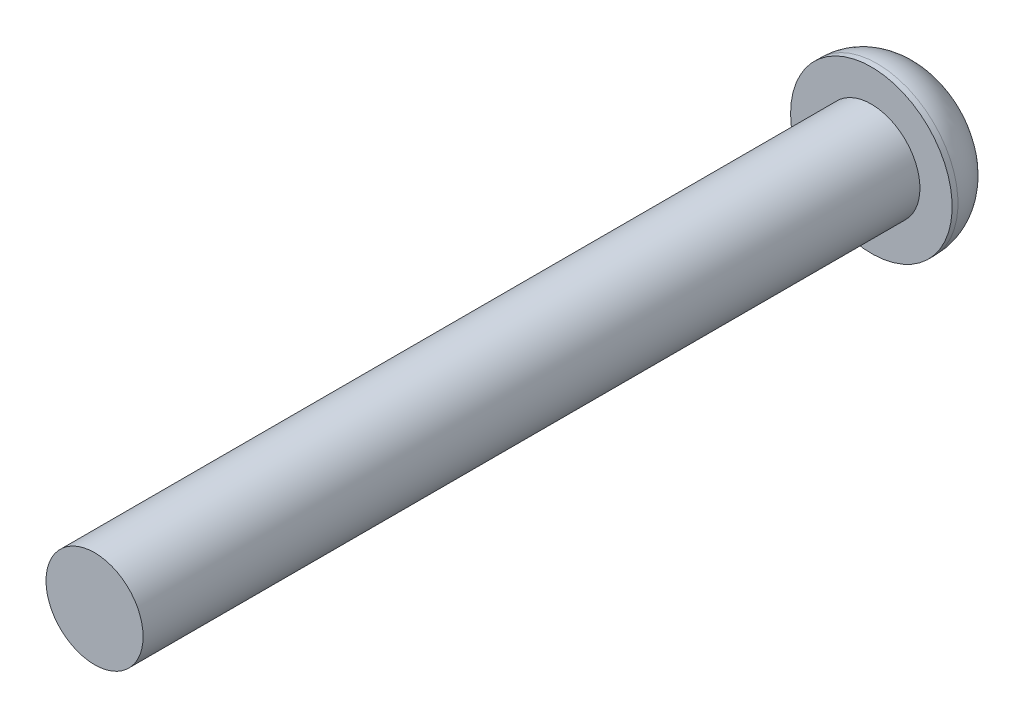
ISO-10303-21;
HEADER;
FILE_DESCRIPTION(('STEP AP214'),'2;1');
FILE_NAME('part.step','',(''),(''),'','','');
FILE_SCHEMA(('AUTOMOTIVE_DESIGN { 1 0 10303 214 1 1 1 1 }'));
ENDSEC;
DATA;
#1=APPLICATION_CONTEXT('core data for automotive mechanical design processes');
#2=APPLICATION_PROTOCOL_DEFINITION('international standard','automotive_design',2000,#1);
#3=PRODUCT_CONTEXT('',#1,'mechanical');
#4=PRODUCT('Part','Part','',(#3));
#5=PRODUCT_RELATED_PRODUCT_CATEGORY('part','',(#4));
#6=PRODUCT_DEFINITION_FORMATION('','',#4);
#7=PRODUCT_DEFINITION_CONTEXT('part definition',#1,'design');
#8=PRODUCT_DEFINITION('design','',#6,#7);
#9=PRODUCT_DEFINITION_SHAPE('','',#8);
#10=(LENGTH_UNIT() NAMED_UNIT(*) SI_UNIT(.MILLI.,.METRE.));
#11=(NAMED_UNIT(*) PLANE_ANGLE_UNIT() SI_UNIT($,.RADIAN.));
#12=(NAMED_UNIT(*) SI_UNIT($,.STERADIAN.) SOLID_ANGLE_UNIT());
#13=UNCERTAINTY_MEASURE_WITH_UNIT(LENGTH_MEASURE(1.E-05),#10,'distance_accuracy_value','');
#14=(GEOMETRIC_REPRESENTATION_CONTEXT(3) GLOBAL_UNCERTAINTY_ASSIGNED_CONTEXT((#13)) GLOBAL_UNIT_ASSIGNED_CONTEXT((#10,
#11,#12)) REPRESENTATION_CONTEXT('',''));
#15=CARTESIAN_POINT('',(0.,0.,0.));
#16=DIRECTION('',(0.,0.,1.));
#17=DIRECTION('',(1.,0.,0.));
#18=AXIS2_PLACEMENT_3D('',#15,#16,#17);
#19=CARTESIAN_POINT('',(0.,0.,40.));
#20=DIRECTION('',(0.,0.,-1.));
#21=DIRECTION('',(-1.,0.,0.));
#22=AXIS2_PLACEMENT_3D('',#19,#20,#21);
#23=CYLINDRICAL_SURFACE('',#22,2.5);
#24=CARTESIAN_POINT('',(0.,0.,40.));
#25=DIRECTION('',(0.,0.,1.));
#26=DIRECTION('',(1.,0.,0.));
#27=AXIS2_PLACEMENT_3D('',#24,#25,#26);
#28=CIRCLE('',#27,2.5);
#29=CARTESIAN_POINT('',(2.5,0.,40.));
#30=VERTEX_POINT('',#29);
#31=EDGE_CURVE('E146',#30,#30,#28,.T.);
#32=ORIENTED_EDGE('',*,*,#31,.F.);
#33=EDGE_LOOP('',(#32));
#34=FACE_BOUND('',#33,.T.);
#35=CARTESIAN_POINT('',(0.,0.,0.));
#36=DIRECTION('',(0.,0.,-1.));
#37=DIRECTION('',(-1.,0.,0.));
#38=AXIS2_PLACEMENT_3D('',#35,#36,#37);
#39=CIRCLE('',#38,2.5);
#40=CARTESIAN_POINT('',(-2.5,0.,0.));
#41=VERTEX_POINT('',#40);
#42=EDGE_CURVE('E143',#41,#41,#39,.T.);
#43=ORIENTED_EDGE('',*,*,#42,.F.);
#44=EDGE_LOOP('',(#43));
#45=FACE_BOUND('',#44,.T.);
#46=ADVANCED_FACE('F33',(#34,#45),#23,.T.);
#47=CARTESIAN_POINT('',(0.,0.,40.));
#48=DIRECTION('',(0.,0.,1.));
#49=DIRECTION('',(1.,0.,0.));
#50=AXIS2_PLACEMENT_3D('',#47,#48,#49);
#51=PLANE('',#50);
#52=ORIENTED_EDGE('',*,*,#31,.T.);
#53=EDGE_LOOP('',(#52));
#54=FACE_BOUND('',#53,.T.);
#55=ADVANCED_FACE('F167',(#54),#51,.T.);
#56=CARTESIAN_POINT('',(0.,0.,0.));
#57=DIRECTION('',(0.,0.,-1.));
#58=DIRECTION('',(-1.,0.,0.));
#59=AXIS2_PLACEMENT_3D('',#56,#57,#58);
#60=PLANE('',#59);
#61=CARTESIAN_POINT('',(0.,0.,0.));
#62=DIRECTION('',(0.,0.,-1.));
#63=DIRECTION('',(-1.,0.,0.));
#64=AXIS2_PLACEMENT_3D('',#61,#62,#63);
#65=CIRCLE('',#64,4.15958487677486);
#66=CARTESIAN_POINT('',(-4.15958487677486,0.,0.));
#67=VERTEX_POINT('',#66);
#68=EDGE_CURVE('E135',#67,#67,#65,.T.);
#69=ORIENTED_EDGE('',*,*,#68,.F.);
#70=EDGE_LOOP('',(#69));
#71=FACE_BOUND('',#70,.T.);
#72=ORIENTED_EDGE('',*,*,#42,.T.);
#73=EDGE_LOOP('',(#72));
#74=FACE_BOUND('',#73,.T.);
#75=ADVANCED_FACE('F172',(#71,#74),#60,.F.);
#76=CARTESIAN_POINT('',(0.,0.,-2.8));
#77=DIRECTION('',(0.,0.,1.));
#78=DIRECTION('',(1.,0.,0.));
#79=AXIS2_PLACEMENT_3D('',#76,#77,#78);
#80=CYLINDRICAL_SURFACE('',#79,4.15958487677486);
#81=CARTESIAN_POINT('',(0.,0.,-0.3));
#82=DIRECTION('',(0.,0.,-1.));
#83=DIRECTION('',(-1.,0.,0.));
#84=AXIS2_PLACEMENT_3D('',#81,#82,#83);
#85=CIRCLE('',#84,4.15958487677486);
#86=CARTESIAN_POINT('',(-4.15958487677486,0.,-0.3));
#87=VERTEX_POINT('',#86);
#88=EDGE_CURVE('E11',#87,#87,#85,.F.);
#89=ORIENTED_EDGE('',*,*,#88,.T.);
#90=EDGE_LOOP('',(#89));
#91=FACE_BOUND('',#90,.T.);
#92=ORIENTED_EDGE('',*,*,#68,.T.);
#93=EDGE_LOOP('',(#92));
#94=FACE_BOUND('',#93,.T.);
#95=ADVANCED_FACE('F162',(#91,#94),#80,.T.);
#96=CARTESIAN_POINT('',(0.,0.,-2.8));
#97=DIRECTION('',(0.,0.,-1.));
#98=DIRECTION('',(-1.,0.,0.));
#99=AXIS2_PLACEMENT_3D('',#96,#97,#98);
#100=PLANE('',#99);
#101=DIRECTION('',(-0.814788791019046,0.579757902947188,0.));
#102=VECTOR('',#101,1.);
#103=CARTESIAN_POINT('',(-0.144973678126217,-1.52414450415627,-2.8));
#104=LINE('',#103,#102);
#105=CARTESIAN_POINT('',(-0.144973678126217,-1.52414450415627,-2.8));
#106=VERTEX_POINT('',#105);
#107=CARTESIAN_POINT('',(-1.39243469870088,-0.636521363940765,-2.8));
#108=VERTEX_POINT('',#107);
#109=EDGE_CURVE('E48',#106,#108,#104,.T.);
#110=ORIENTED_EDGE('',*,*,#109,.F.);
#111=DIRECTION('',(-0.909479467506581,-0.415748840267711,0.));
#112=VECTOR('',#111,1.);
#113=CARTESIAN_POINT('',(1.24746102057466,-0.887623140215509,-2.8));
#114=LINE('',#113,#112);
#115=CARTESIAN_POINT('',(1.24746102057466,-0.887623140215509,-2.8));
#116=VERTEX_POINT('',#115);
#117=EDGE_CURVE('E131',#116,#106,#114,.T.);
#118=ORIENTED_EDGE('',*,*,#117,.F.);
#119=DIRECTION('',(-0.0946906764875342,-0.995506743214898,0.));
#120=VECTOR('',#119,1.);
#121=CARTESIAN_POINT('',(1.39243469870088,0.636521363940765,-2.8));
#122=LINE('',#121,#120);
#123=CARTESIAN_POINT('',(1.39243469870088,0.636521363940765,-2.8));
#124=VERTEX_POINT('',#123);
#125=EDGE_CURVE('E129',#124,#116,#122,.T.);
#126=ORIENTED_EDGE('',*,*,#125,.F.);
#127=DIRECTION('',(0.814788791019046,-0.579757902947188,0.));
#128=VECTOR('',#127,1.);
#129=CARTESIAN_POINT('',(0.144973678126217,1.52414450415627,-2.8));
#130=LINE('',#129,#128);
#131=CARTESIAN_POINT('',(0.144973678126217,1.52414450415627,-2.8));
#132=VERTEX_POINT('',#131);
#133=EDGE_CURVE('E96',#132,#124,#130,.T.);
#134=ORIENTED_EDGE('',*,*,#133,.F.);
#135=DIRECTION('',(0.909479467506581,0.41574884026771,0.));
#136=VECTOR('',#135,1.);
#137=CARTESIAN_POINT('',(-1.24746102057466,0.88762314021551,-2.8));
#138=LINE('',#137,#136);
#139=CARTESIAN_POINT('',(-1.24746102057466,0.88762314021551,-2.8));
#140=VERTEX_POINT('',#139);
#141=EDGE_CURVE('E125',#140,#132,#138,.T.);
#142=ORIENTED_EDGE('',*,*,#141,.F.);
#143=DIRECTION('',(0.0946906764875343,0.995506743214898,0.));
#144=VECTOR('',#143,1.);
#145=CARTESIAN_POINT('',(-1.39243469870088,-0.636521363940765,-2.8));
#146=LINE('',#145,#144);
#147=EDGE_CURVE('E122',#108,#140,#146,.T.);
#148=ORIENTED_EDGE('',*,*,#147,.F.);
#149=EDGE_LOOP('',(#110,#118,#126,#134,#142,#148));
#150=FACE_BOUND('',#149,.T.);
#151=CARTESIAN_POINT('',(0.,0.,-2.8));
#152=DIRECTION('',(0.,0.,-1.));
#153=DIRECTION('',(-1.,0.,0.));
#154=AXIS2_PLACEMENT_3D('',#151,#152,#153);
#155=CIRCLE('',#154,1.65958487677486);
#156=CARTESIAN_POINT('',(-1.65958487677486,0.,-2.8));
#157=VERTEX_POINT('',#156);
#158=EDGE_CURVE('E41',#157,#157,#155,.T.);
#159=ORIENTED_EDGE('',*,*,#158,.T.);
#160=EDGE_LOOP('',(#159));
#161=FACE_BOUND('',#160,.T.);
#162=ADVANCED_FACE('F151',(#150,#161),#100,.T.);
#163=CARTESIAN_POINT('',(0.,0.,-0.3));
#164=DIRECTION('',(0.,0.,-1.));
#165=DIRECTION('',(-1.,0.,0.));
#166=AXIS2_PLACEMENT_3D('',#163,#164,#165);
#167=DEGENERATE_TOROIDAL_SURFACE('',#166,1.65958487677486,2.5,.T.);
#168=ORIENTED_EDGE('',*,*,#88,.F.);
#169=EDGE_LOOP('',(#168));
#170=FACE_BOUND('',#169,.T.);
#171=ORIENTED_EDGE('',*,*,#158,.F.);
#172=EDGE_LOOP('',(#171));
#173=FACE_BOUND('',#172,.T.);
#174=ADVANCED_FACE('F35',(#170,#173),#167,.T.);
#175=CARTESIAN_POINT('',(-0.144973678126217,-1.52414450415627,-0.8));
#176=DIRECTION('',(-0.579757902947188,-0.814788791019046,0.));
#177=DIRECTION('',(0.814788791019046,-0.579757902947188,0.));
#178=AXIS2_PLACEMENT_3D('',#175,#176,#177);
#179=PLANE('',#178);
#180=ORIENTED_EDGE('',*,*,#109,.T.);
#181=DIRECTION('',(0.,0.,-1.));
#182=VECTOR('',#181,1.);
#183=CARTESIAN_POINT('',(-1.39243469870088,-0.636521363940765,-0.8));
#184=LINE('',#183,#182);
#185=CARTESIAN_POINT('',(-1.39243469870088,-0.636521363940765,-0.8));
#186=VERTEX_POINT('',#185);
#187=EDGE_CURVE('E78',#186,#108,#184,.T.);
#188=ORIENTED_EDGE('',*,*,#187,.F.);
#189=DIRECTION('',(-0.814788791019046,0.579757902947188,0.));
#190=VECTOR('',#189,1.);
#191=CARTESIAN_POINT('',(-0.144973678126217,-1.52414450415627,-0.8));
#192=LINE('',#191,#190);
#193=CARTESIAN_POINT('',(-0.144973678126217,-1.52414450415627,-0.8));
#194=VERTEX_POINT('',#193);
#195=EDGE_CURVE('E133',#194,#186,#192,.T.);
#196=ORIENTED_EDGE('',*,*,#195,.F.);
#197=DIRECTION('',(0.,0.,-1.));
#198=VECTOR('',#197,1.);
#199=CARTESIAN_POINT('',(-0.144973678126217,-1.52414450415627,-0.8));
#200=LINE('',#199,#198);
#201=EDGE_CURVE('E56',#194,#106,#200,.T.);
#202=ORIENTED_EDGE('',*,*,#201,.T.);
#203=EDGE_LOOP('',(#180,#188,#196,#202));
#204=FACE_BOUND('',#203,.T.);
#205=ADVANCED_FACE('F154',(#204),#179,.F.);
#206=CARTESIAN_POINT('',(1.24746102057466,-0.887623140215509,-0.8));
#207=DIRECTION('',(0.415748840267711,-0.909479467506581,0.));
#208=DIRECTION('',(0.909479467506581,0.415748840267711,0.));
#209=AXIS2_PLACEMENT_3D('',#206,#207,#208);
#210=PLANE('',#209);
#211=ORIENTED_EDGE('',*,*,#117,.T.);
#212=ORIENTED_EDGE('',*,*,#201,.F.);
#213=DIRECTION('',(-0.909479467506581,-0.415748840267711,0.));
#214=VECTOR('',#213,1.);
#215=CARTESIAN_POINT('',(1.24746102057466,-0.887623140215509,-0.8));
#216=LINE('',#215,#214);
#217=CARTESIAN_POINT('',(1.24746102057466,-0.887623140215509,-0.8));
#218=VERTEX_POINT('',#217);
#219=EDGE_CURVE('E108',#218,#194,#216,.T.);
#220=ORIENTED_EDGE('',*,*,#219,.F.);
#221=DIRECTION('',(0.,0.,-1.));
#222=VECTOR('',#221,1.);
#223=CARTESIAN_POINT('',(1.24746102057466,-0.887623140215509,-0.8));
#224=LINE('',#223,#222);
#225=EDGE_CURVE('E100',#218,#116,#224,.T.);
#226=ORIENTED_EDGE('',*,*,#225,.T.);
#227=EDGE_LOOP('',(#211,#212,#220,#226));
#228=FACE_BOUND('',#227,.T.);
#229=ADVANCED_FACE('F160',(#228),#210,.F.);
#230=CARTESIAN_POINT('',(1.39243469870088,0.636521363940765,-0.8));
#231=DIRECTION('',(0.995506743214898,-0.0946906764875343,0.));
#232=DIRECTION('',(0.0946906764875343,0.995506743214898,0.));
#233=AXIS2_PLACEMENT_3D('',#230,#231,#232);
#234=PLANE('',#233);
#235=ORIENTED_EDGE('',*,*,#125,.T.);
#236=ORIENTED_EDGE('',*,*,#225,.F.);
#237=DIRECTION('',(-0.0946906764875342,-0.995506743214898,0.));
#238=VECTOR('',#237,1.);
#239=CARTESIAN_POINT('',(1.39243469870088,0.636521363940765,-0.8));
#240=LINE('',#239,#238);
#241=CARTESIAN_POINT('',(1.39243469870088,0.636521363940765,-0.8));
#242=VERTEX_POINT('',#241);
#243=EDGE_CURVE('E104',#242,#218,#240,.T.);
#244=ORIENTED_EDGE('',*,*,#243,.F.);
#245=DIRECTION('',(0.,0.,-1.));
#246=VECTOR('',#245,1.);
#247=CARTESIAN_POINT('',(1.39243469870088,0.636521363940765,-0.8));
#248=LINE('',#247,#246);
#249=EDGE_CURVE('E89',#242,#124,#248,.T.);
#250=ORIENTED_EDGE('',*,*,#249,.T.);
#251=EDGE_LOOP('',(#235,#236,#244,#250));
#252=FACE_BOUND('',#251,.T.);
#253=ADVANCED_FACE('F105',(#252),#234,.F.);
#254=CARTESIAN_POINT('',(0.144973678126217,1.52414450415627,-0.8));
#255=DIRECTION('',(0.579757902947188,0.814788791019046,0.));
#256=DIRECTION('',(-0.814788791019047,0.579757902947188,0.));
#257=AXIS2_PLACEMENT_3D('',#254,#255,#256);
#258=PLANE('',#257);
#259=ORIENTED_EDGE('',*,*,#133,.T.);
#260=ORIENTED_EDGE('',*,*,#249,.F.);
#261=DIRECTION('',(0.814788791019046,-0.579757902947188,0.));
#262=VECTOR('',#261,1.);
#263=CARTESIAN_POINT('',(0.144973678126217,1.52414450415627,-0.8));
#264=LINE('',#263,#262);
#265=CARTESIAN_POINT('',(0.144973678126217,1.52414450415627,-0.8));
#266=VERTEX_POINT('',#265);
#267=EDGE_CURVE('E93',#266,#242,#264,.T.);
#268=ORIENTED_EDGE('',*,*,#267,.F.);
#269=DIRECTION('',(0.,0.,-1.));
#270=VECTOR('',#269,1.);
#271=CARTESIAN_POINT('',(0.144973678126217,1.52414450415627,-0.8));
#272=LINE('',#271,#270);
#273=EDGE_CURVE('E101',#266,#132,#272,.T.);
#274=ORIENTED_EDGE('',*,*,#273,.T.);
#275=EDGE_LOOP('',(#259,#260,#268,#274));
#276=FACE_BOUND('',#275,.T.);
#277=ADVANCED_FACE('F91',(#276),#258,.F.);
#278=CARTESIAN_POINT('',(-1.24746102057466,0.88762314021551,-0.8));
#279=DIRECTION('',(-0.41574884026771,0.909479467506581,0.));
#280=DIRECTION('',(-0.909479467506581,-0.41574884026771,0.));
#281=AXIS2_PLACEMENT_3D('',#278,#279,#280);
#282=PLANE('',#281);
#283=ORIENTED_EDGE('',*,*,#141,.T.);
#284=ORIENTED_EDGE('',*,*,#273,.F.);
#285=DIRECTION('',(0.909479467506581,0.41574884026771,0.));
#286=VECTOR('',#285,1.);
#287=CARTESIAN_POINT('',(-1.24746102057466,0.88762314021551,-0.8));
#288=LINE('',#287,#286);
#289=CARTESIAN_POINT('',(-1.24746102057466,0.88762314021551,-0.8));
#290=VERTEX_POINT('',#289);
#291=EDGE_CURVE('E114',#290,#266,#288,.T.);
#292=ORIENTED_EDGE('',*,*,#291,.F.);
#293=DIRECTION('',(0.,0.,-1.));
#294=VECTOR('',#293,1.);
#295=CARTESIAN_POINT('',(-1.24746102057466,0.88762314021551,-0.8));
#296=LINE('',#295,#294);
#297=EDGE_CURVE('E138',#290,#140,#296,.T.);
#298=ORIENTED_EDGE('',*,*,#297,.T.);
#299=EDGE_LOOP('',(#283,#284,#292,#298));
#300=FACE_BOUND('',#299,.T.);
#301=ADVANCED_FACE('F187',(#300),#282,.F.);
#302=CARTESIAN_POINT('',(-1.39243469870088,-0.636521363940765,-0.8));
#303=DIRECTION('',(-0.995506743214898,0.0946906764875343,0.));
#304=DIRECTION('',(-0.0946906764875343,-0.995506743214898,0.));
#305=AXIS2_PLACEMENT_3D('',#302,#303,#304);
#306=PLANE('',#305);
#307=ORIENTED_EDGE('',*,*,#147,.T.);
#308=ORIENTED_EDGE('',*,*,#297,.F.);
#309=DIRECTION('',(0.0946906764875343,0.995506743214898,0.));
#310=VECTOR('',#309,1.);
#311=CARTESIAN_POINT('',(-1.39243469870088,-0.636521363940765,-0.8));
#312=LINE('',#311,#310);
#313=EDGE_CURVE('E116',#186,#290,#312,.T.);
#314=ORIENTED_EDGE('',*,*,#313,.F.);
#315=ORIENTED_EDGE('',*,*,#187,.T.);
#316=EDGE_LOOP('',(#307,#308,#314,#315));
#317=FACE_BOUND('',#316,.T.);
#318=ADVANCED_FACE('F184',(#317),#306,.F.);
#319=CARTESIAN_POINT('',(0.,0.,-0.8));
#320=DIRECTION('',(0.,0.,-1.));
#321=DIRECTION('',(-1.,0.,0.));
#322=AXIS2_PLACEMENT_3D('',#319,#320,#321);
#323=PLANE('',#322);
#324=ORIENTED_EDGE('',*,*,#195,.T.);
#325=ORIENTED_EDGE('',*,*,#313,.T.);
#326=ORIENTED_EDGE('',*,*,#291,.T.);
#327=ORIENTED_EDGE('',*,*,#267,.T.);
#328=ORIENTED_EDGE('',*,*,#243,.T.);
#329=ORIENTED_EDGE('',*,*,#219,.T.);
#330=EDGE_LOOP('',(#324,#325,#326,#327,#328,#329));
#331=FACE_BOUND('',#330,.T.);
#332=ADVANCED_FACE('F111',(#331),#323,.T.);
#333=CLOSED_SHELL('',(#46,#55,#75,#95,#162,#174,#205,#229,#253,#277,#301,#318,#332));
#334=MANIFOLD_SOLID_BREP('B2',#333);
#335=ADVANCED_BREP_SHAPE_REPRESENTATION('',(#18,#334),#14);
#336=SHAPE_DEFINITION_REPRESENTATION(#9,#335);
ENDSEC;
END-ISO-10303-21;
